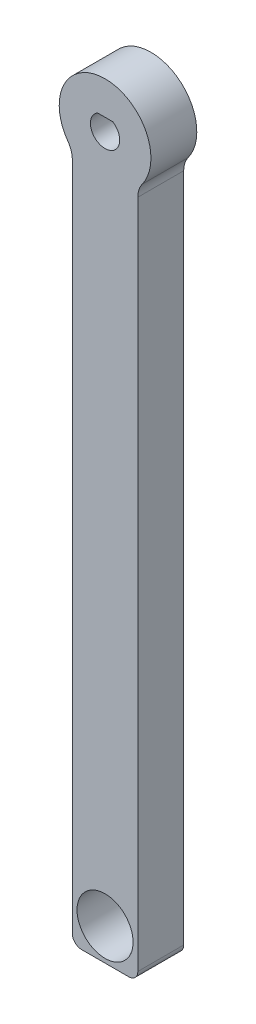
ISO-10303-21;
HEADER;
FILE_DESCRIPTION(('STEP AP214'),'2;1');
FILE_NAME('part.step','',(''),(''),'','','');
FILE_SCHEMA(('AUTOMOTIVE_DESIGN { 1 0 10303 214 1 1 1 1 }'));
ENDSEC;
DATA;
#1=APPLICATION_CONTEXT('core data for automotive mechanical design processes');
#2=APPLICATION_PROTOCOL_DEFINITION('international standard','automotive_design',2000,#1);
#3=PRODUCT_CONTEXT('',#1,'mechanical');
#4=PRODUCT('Part','Part','',(#3));
#5=PRODUCT_RELATED_PRODUCT_CATEGORY('part','',(#4));
#6=PRODUCT_DEFINITION_FORMATION('','',#4);
#7=PRODUCT_DEFINITION_CONTEXT('part definition',#1,'design');
#8=PRODUCT_DEFINITION('design','',#6,#7);
#9=PRODUCT_DEFINITION_SHAPE('','',#8);
#10=(LENGTH_UNIT() NAMED_UNIT(*) SI_UNIT(.MILLI.,.METRE.));
#11=(NAMED_UNIT(*) PLANE_ANGLE_UNIT() SI_UNIT($,.RADIAN.));
#12=(NAMED_UNIT(*) SI_UNIT($,.STERADIAN.) SOLID_ANGLE_UNIT());
#13=UNCERTAINTY_MEASURE_WITH_UNIT(LENGTH_MEASURE(1.E-05),#10,'distance_accuracy_value','');
#14=(GEOMETRIC_REPRESENTATION_CONTEXT(3) GLOBAL_UNCERTAINTY_ASSIGNED_CONTEXT((#13)) GLOBAL_UNIT_ASSIGNED_CONTEXT((#10,
#11,#12)) REPRESENTATION_CONTEXT('',''));
#15=CARTESIAN_POINT('',(0.,0.,0.));
#16=DIRECTION('',(0.,0.,1.));
#17=DIRECTION('',(1.,0.,0.));
#18=AXIS2_PLACEMENT_3D('',#15,#16,#17);
#19=CARTESIAN_POINT('',(0.,0.,10.));
#20=DIRECTION('',(0.,0.,-1.));
#21=DIRECTION('',(-1.,0.,0.));
#22=AXIS2_PLACEMENT_3D('',#19,#20,#21);
#23=CYLINDRICAL_SURFACE('',#22,10.);
#24=CARTESIAN_POINT('',(0.,0.,0.));
#25=DIRECTION('',(0.,0.,1.));
#26=DIRECTION('',(1.,0.,0.));
#27=AXIS2_PLACEMENT_3D('',#24,#25,#26);
#28=CIRCLE('',#27,10.);
#29=CARTESIAN_POINT('',(8.09428561902857,-5.87218360727824,0.));
#30=VERTEX_POINT('',#29);
#31=CARTESIAN_POINT('',(-8.09428561902857,-5.87218360727824,0.));
#32=VERTEX_POINT('',#31);
#33=EDGE_CURVE('E136',#30,#32,#28,.T.);
#34=ORIENTED_EDGE('',*,*,#33,.T.);
#35=DIRECTION('',(0.,0.,-1.));
#36=VECTOR('',#35,1.);
#37=CARTESIAN_POINT('',(-8.09428561902857,-5.87218360727824,10.));
#38=LINE('',#37,#36);
#39=CARTESIAN_POINT('',(-8.09428561902857,-5.87218360727824,10.));
#40=VERTEX_POINT('',#39);
#41=EDGE_CURVE('E155',#32,#40,#38,.F.);
#42=ORIENTED_EDGE('',*,*,#41,.T.);
#43=CARTESIAN_POINT('',(0.,0.,10.));
#44=DIRECTION('',(0.,0.,1.));
#45=DIRECTION('',(1.,0.,0.));
#46=AXIS2_PLACEMENT_3D('',#43,#44,#45);
#47=CIRCLE('',#46,10.);
#48=CARTESIAN_POINT('',(8.09428561902857,-5.87218360727824,10.));
#49=VERTEX_POINT('',#48);
#50=EDGE_CURVE('E132',#49,#40,#47,.T.);
#51=ORIENTED_EDGE('',*,*,#50,.F.);
#52=DIRECTION('',(0.,0.,-1.));
#53=VECTOR('',#52,1.);
#54=CARTESIAN_POINT('',(8.09428561902857,-5.87218360727824,10.));
#55=LINE('',#54,#53);
#56=EDGE_CURVE('E152',#49,#30,#55,.T.);
#57=ORIENTED_EDGE('',*,*,#56,.T.);
#58=EDGE_LOOP('',(#34,#42,#51,#57));
#59=FACE_BOUND('',#58,.T.);
#60=ADVANCED_FACE('F38',(#59),#23,.T.);
#61=CARTESIAN_POINT('',(0.,0.,10.));
#62=DIRECTION('',(0.,0.,1.));
#63=DIRECTION('',(1.,0.,0.));
#64=AXIS2_PLACEMENT_3D('',#61,#62,#63);
#65=PLANE('',#64);
#66=CARTESIAN_POINT('',(0.,-150.,10.));
#67=DIRECTION('',(0.,0.,-1.));
#68=DIRECTION('',(-1.,0.,0.));
#69=AXIS2_PLACEMENT_3D('',#66,#67,#68);
#70=CIRCLE('',#69,6.11);
#71=CARTESIAN_POINT('',(-6.11,-150.,10.));
#72=VERTEX_POINT('',#71);
#73=EDGE_CURVE('E194',#72,#72,#70,.T.);
#74=ORIENTED_EDGE('',*,*,#73,.T.);
#75=EDGE_LOOP('',(#74));
#76=FACE_BOUND('',#75,.T.);
#77=CARTESIAN_POINT('',(0.,0.,10.));
#78=DIRECTION('',(0.,0.,1.));
#79=DIRECTION('',(1.,0.,0.));
#80=AXIS2_PLACEMENT_3D('',#77,#78,#79);
#81=CIRCLE('',#80,3.19);
#82=CARTESIAN_POINT('',(-1.66664333317,2.72,10.));
#83=VERTEX_POINT('',#82);
#84=CARTESIAN_POINT('',(1.66664333317,2.72,10.));
#85=VERTEX_POINT('',#84);
#86=EDGE_CURVE('E119',#83,#85,#81,.T.);
#87=ORIENTED_EDGE('',*,*,#86,.F.);
#88=DIRECTION('',(1.,0.,0.));
#89=VECTOR('',#88,1.);
#90=CARTESIAN_POINT('',(0.,2.72,10.));
#91=LINE('',#90,#89);
#92=EDGE_CURVE('E129',#83,#85,#91,.T.);
#93=ORIENTED_EDGE('',*,*,#92,.T.);
#94=EDGE_LOOP('',(#87,#93));
#95=FACE_BOUND('',#94,.T.);
#96=DIRECTION('',(-1.,0.,0.));
#97=VECTOR('',#96,1.);
#98=CARTESIAN_POINT('',(7.14142842854285,-157.,10.));
#99=LINE('',#98,#97);
#100=CARTESIAN_POINT('',(5.14142842854285,-157.,10.));
#101=VERTEX_POINT('',#100);
#102=CARTESIAN_POINT('',(-5.14142842854285,-157.,10.));
#103=VERTEX_POINT('',#102);
#104=EDGE_CURVE('E193',#101,#103,#99,.T.);
#105=ORIENTED_EDGE('',*,*,#104,.F.);
#106=CARTESIAN_POINT('',(5.14142842854285,-155.,10.));
#107=DIRECTION('',(0.,0.,1.));
#108=DIRECTION('',(1.,0.,0.));
#109=AXIS2_PLACEMENT_3D('',#106,#107,#108);
#110=CIRCLE('',#109,2.);
#111=CARTESIAN_POINT('',(7.14142842854285,-155.,10.));
#112=VERTEX_POINT('',#111);
#113=EDGE_CURVE('E178',#101,#112,#110,.T.);
#114=ORIENTED_EDGE('',*,*,#113,.T.);
#115=DIRECTION('',(0.,1.,0.));
#116=VECTOR('',#115,1.);
#117=CARTESIAN_POINT('',(7.14142842854285,-157.,10.));
#118=LINE('',#117,#116);
#119=CARTESIAN_POINT('',(7.14142842854285,-8.80827541091736,10.));
#120=VERTEX_POINT('',#119);
#121=EDGE_CURVE('E197',#112,#120,#118,.T.);
#122=ORIENTED_EDGE('',*,*,#121,.T.);
#123=CARTESIAN_POINT('',(12.1414284285429,-8.80827541091737,10.));
#124=DIRECTION('',(0.,0.,1.));
#125=DIRECTION('',(1.,0.,0.));
#126=AXIS2_PLACEMENT_3D('',#123,#124,#125);
#127=CIRCLE('',#126,5.);
#128=EDGE_CURVE('E168',#120,#49,#127,.F.);
#129=ORIENTED_EDGE('',*,*,#128,.T.);
#130=ORIENTED_EDGE('',*,*,#50,.T.);
#131=CARTESIAN_POINT('',(-12.1414284285429,-8.80827541091737,10.));
#132=DIRECTION('',(0.,0.,1.));
#133=DIRECTION('',(1.,0.,0.));
#134=AXIS2_PLACEMENT_3D('',#131,#132,#133);
#135=CIRCLE('',#134,5.);
#136=CARTESIAN_POINT('',(-7.14142842854285,-8.80827541091736,10.));
#137=VERTEX_POINT('',#136);
#138=EDGE_CURVE('E162',#40,#137,#135,.F.);
#139=ORIENTED_EDGE('',*,*,#138,.T.);
#140=DIRECTION('',(0.,1.,0.));
#141=VECTOR('',#140,1.);
#142=CARTESIAN_POINT('',(-7.14142842854285,-157.,10.));
#143=LINE('',#142,#141);
#144=CARTESIAN_POINT('',(-7.14142842854285,-155.,10.));
#145=VERTEX_POINT('',#144);
#146=EDGE_CURVE('E201',#145,#137,#143,.T.);
#147=ORIENTED_EDGE('',*,*,#146,.F.);
#148=CARTESIAN_POINT('',(-5.14142842854285,-155.,10.));
#149=DIRECTION('',(0.,0.,1.));
#150=DIRECTION('',(1.,0.,0.));
#151=AXIS2_PLACEMENT_3D('',#148,#149,#150);
#152=CIRCLE('',#151,2.);
#153=EDGE_CURVE('E176',#145,#103,#152,.T.);
#154=ORIENTED_EDGE('',*,*,#153,.T.);
#155=EDGE_LOOP('',(#105,#114,#122,#129,#130,#139,#147,#154));
#156=FACE_BOUND('',#155,.T.);
#157=ADVANCED_FACE('F134',(#76,#95,#156),#65,.T.);
#158=CARTESIAN_POINT('',(0.,0.,0.));
#159=DIRECTION('',(0.,0.,1.));
#160=DIRECTION('',(1.,0.,0.));
#161=AXIS2_PLACEMENT_3D('',#158,#159,#160);
#162=PLANE('',#161);
#163=CARTESIAN_POINT('',(0.,-150.,0.));
#164=DIRECTION('',(0.,0.,-1.));
#165=DIRECTION('',(-1.,0.,0.));
#166=AXIS2_PLACEMENT_3D('',#163,#164,#165);
#167=CIRCLE('',#166,6.11);
#168=CARTESIAN_POINT('',(-6.11,-150.,0.));
#169=VERTEX_POINT('',#168);
#170=EDGE_CURVE('E206',#169,#169,#167,.T.);
#171=ORIENTED_EDGE('',*,*,#170,.F.);
#172=EDGE_LOOP('',(#171));
#173=FACE_BOUND('',#172,.T.);
#174=CARTESIAN_POINT('',(0.,0.,0.));
#175=DIRECTION('',(0.,0.,1.));
#176=DIRECTION('',(1.,0.,0.));
#177=AXIS2_PLACEMENT_3D('',#174,#175,#176);
#178=CIRCLE('',#177,3.19);
#179=CARTESIAN_POINT('',(-1.66664333317,2.72,0.));
#180=VERTEX_POINT('',#179);
#181=CARTESIAN_POINT('',(1.66664333317,2.72,0.));
#182=VERTEX_POINT('',#181);
#183=EDGE_CURVE('E121',#180,#182,#178,.T.);
#184=ORIENTED_EDGE('',*,*,#183,.T.);
#185=DIRECTION('',(1.,0.,0.));
#186=VECTOR('',#185,1.);
#187=CARTESIAN_POINT('',(0.,2.72,0.));
#188=LINE('',#187,#186);
#189=EDGE_CURVE('E139',#180,#182,#188,.T.);
#190=ORIENTED_EDGE('',*,*,#189,.F.);
#191=EDGE_LOOP('',(#184,#190));
#192=FACE_BOUND('',#191,.T.);
#193=DIRECTION('',(0.,1.,0.));
#194=VECTOR('',#193,1.);
#195=CARTESIAN_POINT('',(7.14142842854285,-157.,0.));
#196=LINE('',#195,#194);
#197=CARTESIAN_POINT('',(7.14142842854285,-155.,0.));
#198=VERTEX_POINT('',#197);
#199=CARTESIAN_POINT('',(7.14142842854285,-8.80827541091736,0.));
#200=VERTEX_POINT('',#199);
#201=EDGE_CURVE('E185',#198,#200,#196,.T.);
#202=ORIENTED_EDGE('',*,*,#201,.F.);
#203=CARTESIAN_POINT('',(5.14142842854285,-155.,0.));
#204=DIRECTION('',(0.,0.,1.));
#205=DIRECTION('',(1.,0.,0.));
#206=AXIS2_PLACEMENT_3D('',#203,#204,#205);
#207=CIRCLE('',#206,2.);
#208=CARTESIAN_POINT('',(5.14142842854285,-157.,0.));
#209=VERTEX_POINT('',#208);
#210=EDGE_CURVE('E46',#198,#209,#207,.F.);
#211=ORIENTED_EDGE('',*,*,#210,.T.);
#212=DIRECTION('',(1.,0.,0.));
#213=VECTOR('',#212,1.);
#214=CARTESIAN_POINT('',(-7.14142842854285,-157.,0.));
#215=LINE('',#214,#213);
#216=CARTESIAN_POINT('',(-5.14142842854285,-157.,0.));
#217=VERTEX_POINT('',#216);
#218=EDGE_CURVE('E184',#217,#209,#215,.T.);
#219=ORIENTED_EDGE('',*,*,#218,.F.);
#220=CARTESIAN_POINT('',(-5.14142842854285,-155.,0.));
#221=DIRECTION('',(0.,0.,1.));
#222=DIRECTION('',(1.,0.,0.));
#223=AXIS2_PLACEMENT_3D('',#220,#221,#222);
#224=CIRCLE('',#223,2.);
#225=CARTESIAN_POINT('',(-7.14142842854285,-155.,0.));
#226=VERTEX_POINT('',#225);
#227=EDGE_CURVE('E53',#217,#226,#224,.F.);
#228=ORIENTED_EDGE('',*,*,#227,.T.);
#229=DIRECTION('',(0.,1.,0.));
#230=VECTOR('',#229,1.);
#231=CARTESIAN_POINT('',(-7.14142842854285,-157.,0.));
#232=LINE('',#231,#230);
#233=CARTESIAN_POINT('',(-7.14142842854285,-8.80827541091736,0.));
#234=VERTEX_POINT('',#233);
#235=EDGE_CURVE('E142',#226,#234,#232,.T.);
#236=ORIENTED_EDGE('',*,*,#235,.T.);
#237=CARTESIAN_POINT('',(-12.1414284285429,-8.80827541091737,0.));
#238=DIRECTION('',(0.,0.,1.));
#239=DIRECTION('',(1.,0.,0.));
#240=AXIS2_PLACEMENT_3D('',#237,#238,#239);
#241=CIRCLE('',#240,5.);
#242=EDGE_CURVE('E160',#234,#32,#241,.T.);
#243=ORIENTED_EDGE('',*,*,#242,.T.);
#244=ORIENTED_EDGE('',*,*,#33,.F.);
#245=CARTESIAN_POINT('',(12.1414284285429,-8.80827541091737,0.));
#246=DIRECTION('',(0.,0.,1.));
#247=DIRECTION('',(1.,0.,0.));
#248=AXIS2_PLACEMENT_3D('',#245,#246,#247);
#249=CIRCLE('',#248,5.);
#250=EDGE_CURVE('E165',#30,#200,#249,.T.);
#251=ORIENTED_EDGE('',*,*,#250,.T.);
#252=EDGE_LOOP('',(#202,#211,#219,#228,#236,#243,#244,#251));
#253=FACE_BOUND('',#252,.T.);
#254=ADVANCED_FACE('F183',(#173,#192,#253),#162,.F.);
#255=CARTESIAN_POINT('',(0.,0.,10.));
#256=DIRECTION('',(0.,0.,-1.));
#257=DIRECTION('',(-1.,0.,0.));
#258=AXIS2_PLACEMENT_3D('',#255,#256,#257);
#259=CYLINDRICAL_SURFACE('',#258,3.19);
#260=ORIENTED_EDGE('',*,*,#183,.F.);
#261=DIRECTION('',(0.,0.,-1.));
#262=VECTOR('',#261,1.);
#263=CARTESIAN_POINT('',(-1.66664333317,2.72,10.));
#264=LINE('',#263,#262);
#265=EDGE_CURVE('E115',#83,#180,#264,.T.);
#266=ORIENTED_EDGE('',*,*,#265,.F.);
#267=ORIENTED_EDGE('',*,*,#86,.T.);
#268=DIRECTION('',(0.,0.,-1.));
#269=VECTOR('',#268,1.);
#270=CARTESIAN_POINT('',(1.66664333317,2.72,10.));
#271=LINE('',#270,#269);
#272=EDGE_CURVE('E126',#85,#182,#271,.T.);
#273=ORIENTED_EDGE('',*,*,#272,.T.);
#274=EDGE_LOOP('',(#260,#266,#267,#273));
#275=FACE_BOUND('',#274,.T.);
#276=ADVANCED_FACE('F117',(#275),#259,.F.);
#277=CARTESIAN_POINT('',(0.,2.72,10.));
#278=DIRECTION('',(0.,1.,0.));
#279=DIRECTION('',(0.,0.,1.));
#280=AXIS2_PLACEMENT_3D('',#277,#278,#279);
#281=PLANE('',#280);
#282=ORIENTED_EDGE('',*,*,#189,.T.);
#283=ORIENTED_EDGE('',*,*,#272,.F.);
#284=ORIENTED_EDGE('',*,*,#92,.F.);
#285=ORIENTED_EDGE('',*,*,#265,.T.);
#286=EDGE_LOOP('',(#282,#283,#284,#285));
#287=FACE_BOUND('',#286,.T.);
#288=ADVANCED_FACE('F130',(#287),#281,.F.);
#289=CARTESIAN_POINT('',(-7.14142842854285,-157.,10.));
#290=DIRECTION('',(1.,0.,0.));
#291=DIRECTION('',(0.,0.,-1.));
#292=AXIS2_PLACEMENT_3D('',#289,#290,#291);
#293=PLANE('',#292);
#294=ORIENTED_EDGE('',*,*,#235,.F.);
#295=DIRECTION('',(0.,0.,-1.));
#296=VECTOR('',#295,1.);
#297=CARTESIAN_POINT('',(-7.14142842854285,-155.,10.));
#298=LINE('',#297,#296);
#299=EDGE_CURVE('E11',#226,#145,#298,.F.);
#300=ORIENTED_EDGE('',*,*,#299,.T.);
#301=ORIENTED_EDGE('',*,*,#146,.T.);
#302=DIRECTION('',(0.,0.,1.));
#303=VECTOR('',#302,1.);
#304=CARTESIAN_POINT('',(-7.14142842854285,-8.80827541091737,0.));
#305=LINE('',#304,#303);
#306=EDGE_CURVE('E125',#137,#234,#305,.F.);
#307=ORIENTED_EDGE('',*,*,#306,.T.);
#308=EDGE_LOOP('',(#294,#300,#301,#307));
#309=FACE_BOUND('',#308,.T.);
#310=ADVANCED_FACE('F236',(#309),#293,.F.);
#311=CARTESIAN_POINT('',(7.14142842854285,-157.,0.));
#312=DIRECTION('',(-1.,0.,0.));
#313=DIRECTION('',(0.,0.,1.));
#314=AXIS2_PLACEMENT_3D('',#311,#312,#313);
#315=PLANE('',#314);
#316=ORIENTED_EDGE('',*,*,#121,.F.);
#317=DIRECTION('',(0.,0.,1.));
#318=VECTOR('',#317,1.);
#319=CARTESIAN_POINT('',(7.14142842854285,-155.,0.));
#320=LINE('',#319,#318);
#321=EDGE_CURVE('E61',#112,#198,#320,.F.);
#322=ORIENTED_EDGE('',*,*,#321,.T.);
#323=ORIENTED_EDGE('',*,*,#201,.T.);
#324=DIRECTION('',(0.,0.,1.));
#325=VECTOR('',#324,1.);
#326=CARTESIAN_POINT('',(7.14142842854285,-8.80827541091737,10.));
#327=LINE('',#326,#325);
#328=EDGE_CURVE('E157',#200,#120,#327,.T.);
#329=ORIENTED_EDGE('',*,*,#328,.T.);
#330=EDGE_LOOP('',(#316,#322,#323,#329));
#331=FACE_BOUND('',#330,.T.);
#332=ADVANCED_FACE('F198',(#331),#315,.F.);
#333=CARTESIAN_POINT('',(0.,-157.,0.));
#334=DIRECTION('',(0.,-1.,0.));
#335=DIRECTION('',(0.,0.,-1.));
#336=AXIS2_PLACEMENT_3D('',#333,#334,#335);
#337=PLANE('',#336);
#338=ORIENTED_EDGE('',*,*,#218,.T.);
#339=DIRECTION('',(0.,0.,1.));
#340=VECTOR('',#339,1.);
#341=CARTESIAN_POINT('',(5.14142842854285,-157.,10.));
#342=LINE('',#341,#340);
#343=EDGE_CURVE('E173',#209,#101,#342,.T.);
#344=ORIENTED_EDGE('',*,*,#343,.T.);
#345=ORIENTED_EDGE('',*,*,#104,.T.);
#346=DIRECTION('',(0.,0.,-1.));
#347=VECTOR('',#346,1.);
#348=CARTESIAN_POINT('',(-5.14142842854285,-157.,0.));
#349=LINE('',#348,#347);
#350=EDGE_CURVE('E170',#103,#217,#349,.T.);
#351=ORIENTED_EDGE('',*,*,#350,.T.);
#352=EDGE_LOOP('',(#338,#344,#345,#351));
#353=FACE_BOUND('',#352,.T.);
#354=ADVANCED_FACE('F189',(#353),#337,.T.);
#355=CARTESIAN_POINT('',(0.,-150.,10.));
#356=DIRECTION('',(0.,0.,-1.));
#357=DIRECTION('',(-1.,0.,0.));
#358=AXIS2_PLACEMENT_3D('',#355,#356,#357);
#359=CYLINDRICAL_SURFACE('',#358,6.11);
#360=ORIENTED_EDGE('',*,*,#73,.F.);
#361=EDGE_LOOP('',(#360));
#362=FACE_BOUND('',#361,.T.);
#363=ORIENTED_EDGE('',*,*,#170,.T.);
#364=EDGE_LOOP('',(#363));
#365=FACE_BOUND('',#364,.T.);
#366=ADVANCED_FACE('F213',(#362,#365),#359,.F.);
#367=CARTESIAN_POINT('',(-12.1414284285429,-8.80827541091737,10.));
#368=DIRECTION('',(0.,0.,-1.));
#369=DIRECTION('',(-1.,0.,0.));
#370=AXIS2_PLACEMENT_3D('',#367,#368,#369);
#371=CYLINDRICAL_SURFACE('',#370,5.);
#372=ORIENTED_EDGE('',*,*,#138,.F.);
#373=ORIENTED_EDGE('',*,*,#41,.F.);
#374=ORIENTED_EDGE('',*,*,#242,.F.);
#375=ORIENTED_EDGE('',*,*,#306,.F.);
#376=EDGE_LOOP('',(#372,#373,#374,#375));
#377=FACE_BOUND('',#376,.T.);
#378=ADVANCED_FACE('F216',(#377),#371,.F.);
#379=CARTESIAN_POINT('',(12.1414284285429,-8.80827541091737,10.));
#380=DIRECTION('',(0.,0.,-1.));
#381=DIRECTION('',(-1.,0.,0.));
#382=AXIS2_PLACEMENT_3D('',#379,#380,#381);
#383=CYLINDRICAL_SURFACE('',#382,5.);
#384=ORIENTED_EDGE('',*,*,#128,.F.);
#385=ORIENTED_EDGE('',*,*,#328,.F.);
#386=ORIENTED_EDGE('',*,*,#250,.F.);
#387=ORIENTED_EDGE('',*,*,#56,.F.);
#388=EDGE_LOOP('',(#384,#385,#386,#387));
#389=FACE_BOUND('',#388,.T.);
#390=ADVANCED_FACE('F240',(#389),#383,.F.);
#391=CARTESIAN_POINT('',(5.14142842854285,-155.,0.));
#392=DIRECTION('',(0.,0.,-1.));
#393=DIRECTION('',(-1.,0.,0.));
#394=AXIS2_PLACEMENT_3D('',#391,#392,#393);
#395=CYLINDRICAL_SURFACE('',#394,2.);
#396=ORIENTED_EDGE('',*,*,#210,.F.);
#397=ORIENTED_EDGE('',*,*,#321,.F.);
#398=ORIENTED_EDGE('',*,*,#113,.F.);
#399=ORIENTED_EDGE('',*,*,#343,.F.);
#400=EDGE_LOOP('',(#396,#397,#398,#399));
#401=FACE_BOUND('',#400,.T.);
#402=ADVANCED_FACE('F196',(#401),#395,.T.);
#403=CARTESIAN_POINT('',(-5.14142842854285,-155.,0.));
#404=DIRECTION('',(0.,0.,1.));
#405=DIRECTION('',(1.,0.,0.));
#406=AXIS2_PLACEMENT_3D('',#403,#404,#405);
#407=CYLINDRICAL_SURFACE('',#406,2.);
#408=ORIENTED_EDGE('',*,*,#153,.F.);
#409=ORIENTED_EDGE('',*,*,#299,.F.);
#410=ORIENTED_EDGE('',*,*,#227,.F.);
#411=ORIENTED_EDGE('',*,*,#350,.F.);
#412=EDGE_LOOP('',(#408,#409,#410,#411));
#413=FACE_BOUND('',#412,.T.);
#414=ADVANCED_FACE('F40',(#413),#407,.T.);
#415=CLOSED_SHELL('',(#60,#157,#254,#276,#288,#310,#332,#354,#366,#378,#390,#402,#414));
#416=MANIFOLD_SOLID_BREP('B2',#415);
#417=ADVANCED_BREP_SHAPE_REPRESENTATION('',(#18,#416),#14);
#418=SHAPE_DEFINITION_REPRESENTATION(#9,#417);
ENDSEC;
END-ISO-10303-21;
